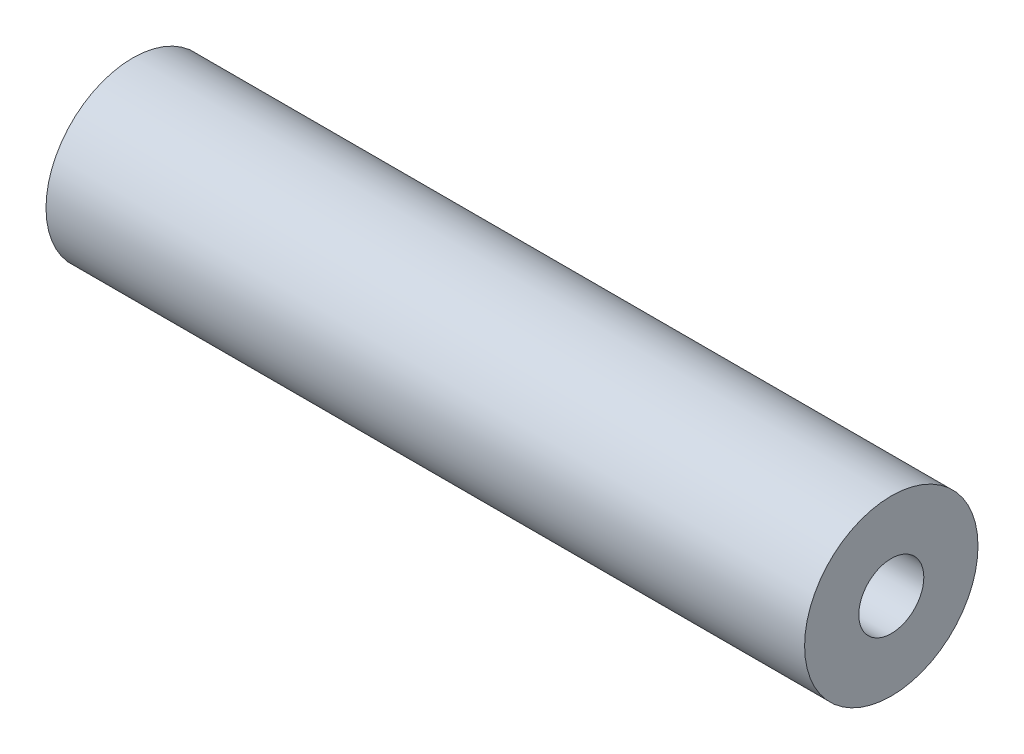
ISO-10303-21;
HEADER;
FILE_DESCRIPTION(('STEP AP214'),'2;1');
FILE_NAME('part.step','',(''),(''),'','','');
FILE_SCHEMA(('AUTOMOTIVE_DESIGN { 1 0 10303 214 1 1 1 1 }'));
ENDSEC;
DATA;
#1=APPLICATION_CONTEXT('core data for automotive mechanical design processes');
#2=APPLICATION_PROTOCOL_DEFINITION('international standard','automotive_design',2000,#1);
#3=PRODUCT_CONTEXT('',#1,'mechanical');
#4=PRODUCT('Part','Part','',(#3));
#5=PRODUCT_RELATED_PRODUCT_CATEGORY('part','',(#4));
#6=PRODUCT_DEFINITION_FORMATION('','',#4);
#7=PRODUCT_DEFINITION_CONTEXT('part definition',#1,'design');
#8=PRODUCT_DEFINITION('design','',#6,#7);
#9=PRODUCT_DEFINITION_SHAPE('','',#8);
#10=(LENGTH_UNIT() NAMED_UNIT(*) SI_UNIT(.MILLI.,.METRE.));
#11=(NAMED_UNIT(*) PLANE_ANGLE_UNIT() SI_UNIT($,.RADIAN.));
#12=(NAMED_UNIT(*) SI_UNIT($,.STERADIAN.) SOLID_ANGLE_UNIT());
#13=UNCERTAINTY_MEASURE_WITH_UNIT(LENGTH_MEASURE(1.E-05),#10,'distance_accuracy_value','');
#14=(GEOMETRIC_REPRESENTATION_CONTEXT(3) GLOBAL_UNCERTAINTY_ASSIGNED_CONTEXT((#13)) GLOBAL_UNIT_ASSIGNED_CONTEXT((#10,
#11,#12)) REPRESENTATION_CONTEXT('',''));
#15=CARTESIAN_POINT('',(0.,0.,0.));
#16=DIRECTION('',(0.,0.,1.));
#17=DIRECTION('',(1.,0.,0.));
#18=AXIS2_PLACEMENT_3D('',#15,#16,#17);
#19=CARTESIAN_POINT('',(35.,0.,0.));
#20=DIRECTION('',(1.,0.,0.));
#21=DIRECTION('',(0.,0.,-1.));
#22=AXIS2_PLACEMENT_3D('',#19,#20,#21);
#23=PLANE('',#22);
#24=CARTESIAN_POINT('',(35.,0.,0.));
#25=DIRECTION('',(1.,0.,0.));
#26=DIRECTION('',(0.,0.,-1.));
#27=AXIS2_PLACEMENT_3D('',#24,#25,#26);
#28=CIRCLE('',#27,4.);
#29=CARTESIAN_POINT('',(35.,0.,-4.));
#30=VERTEX_POINT('',#29);
#31=EDGE_CURVE('E10',#30,#30,#28,.T.);
#32=ORIENTED_EDGE('',*,*,#31,.T.);
#33=EDGE_LOOP('',(#32));
#34=FACE_BOUND('',#33,.T.);
#35=CARTESIAN_POINT('',(35.,0.,0.));
#36=DIRECTION('',(1.,0.,0.));
#37=DIRECTION('',(0.,0.,-1.));
#38=AXIS2_PLACEMENT_3D('',#35,#36,#37);
#39=CIRCLE('',#38,1.5);
#40=CARTESIAN_POINT('',(35.,0.,-1.5));
#41=VERTEX_POINT('',#40);
#42=EDGE_CURVE('E45',#41,#41,#39,.T.);
#43=ORIENTED_EDGE('',*,*,#42,.F.);
#44=EDGE_LOOP('',(#43));
#45=FACE_BOUND('',#44,.T.);
#46=ADVANCED_FACE('F34',(#34,#45),#23,.T.);
#47=CARTESIAN_POINT('',(0.,0.,0.));
#48=DIRECTION('',(1.,0.,0.));
#49=DIRECTION('',(0.,0.,-1.));
#50=AXIS2_PLACEMENT_3D('',#47,#48,#49);
#51=PLANE('',#50);
#52=CARTESIAN_POINT('',(0.,0.,0.));
#53=DIRECTION('',(1.,0.,0.));
#54=DIRECTION('',(0.,0.,-1.));
#55=AXIS2_PLACEMENT_3D('',#52,#53,#54);
#56=CIRCLE('',#55,4.);
#57=CARTESIAN_POINT('',(0.,0.,-4.));
#58=VERTEX_POINT('',#57);
#59=EDGE_CURVE('E38',#58,#58,#56,.T.);
#60=ORIENTED_EDGE('',*,*,#59,.F.);
#61=EDGE_LOOP('',(#60));
#62=FACE_BOUND('',#61,.T.);
#63=CARTESIAN_POINT('',(0.,0.,0.));
#64=DIRECTION('',(1.,0.,0.));
#65=DIRECTION('',(0.,0.,-1.));
#66=AXIS2_PLACEMENT_3D('',#63,#64,#65);
#67=CIRCLE('',#66,1.5);
#68=CARTESIAN_POINT('',(0.,0.,-1.5));
#69=VERTEX_POINT('',#68);
#70=EDGE_CURVE('E47',#69,#69,#67,.T.);
#71=ORIENTED_EDGE('',*,*,#70,.T.);
#72=EDGE_LOOP('',(#71));
#73=FACE_BOUND('',#72,.T.);
#74=ADVANCED_FACE('F57',(#62,#73),#51,.F.);
#75=CARTESIAN_POINT('',(35.,0.,0.));
#76=DIRECTION('',(-1.,0.,0.));
#77=DIRECTION('',(0.,0.,1.));
#78=AXIS2_PLACEMENT_3D('',#75,#76,#77);
#79=CYLINDRICAL_SURFACE('',#78,4.);
#80=ORIENTED_EDGE('',*,*,#31,.F.);
#81=EDGE_LOOP('',(#80));
#82=FACE_BOUND('',#81,.T.);
#83=ORIENTED_EDGE('',*,*,#59,.T.);
#84=EDGE_LOOP('',(#83));
#85=FACE_BOUND('',#84,.T.);
#86=ADVANCED_FACE('F36',(#82,#85),#79,.T.);
#87=CARTESIAN_POINT('',(35.,0.,0.));
#88=DIRECTION('',(-1.,0.,0.));
#89=DIRECTION('',(0.,0.,1.));
#90=AXIS2_PLACEMENT_3D('',#87,#88,#89);
#91=CYLINDRICAL_SURFACE('',#90,1.5);
#92=ORIENTED_EDGE('',*,*,#42,.T.);
#93=EDGE_LOOP('',(#92));
#94=FACE_BOUND('',#93,.T.);
#95=ORIENTED_EDGE('',*,*,#70,.F.);
#96=EDGE_LOOP('',(#95));
#97=FACE_BOUND('',#96,.T.);
#98=ADVANCED_FACE('F53',(#94,#97),#91,.F.);
#99=CLOSED_SHELL('',(#46,#74,#86,#98));
#100=MANIFOLD_SOLID_BREP('B2',#99);
#101=ADVANCED_BREP_SHAPE_REPRESENTATION('',(#18,#100),#14);
#102=SHAPE_DEFINITION_REPRESENTATION(#9,#101);
ENDSEC;
END-ISO-10303-21;
